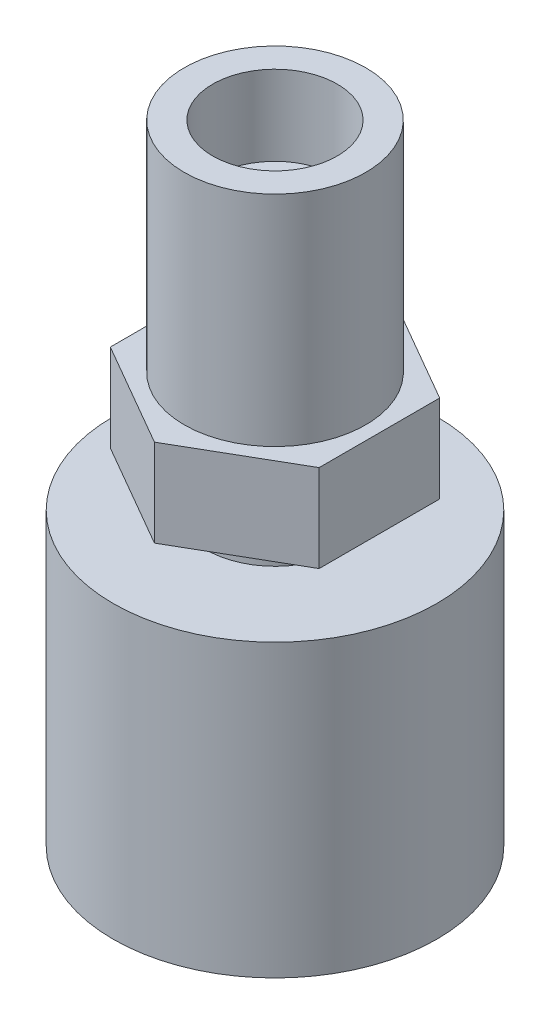
ISO-10303-21;
HEADER;
FILE_DESCRIPTION(('STEP AP214'),'2;1');
FILE_NAME('part.step','',(''),(''),'','','');
FILE_SCHEMA(('AUTOMOTIVE_DESIGN { 1 0 10303 214 1 1 1 1 }'));
ENDSEC;
DATA;
#1=APPLICATION_CONTEXT('core data for automotive mechanical design processes');
#2=APPLICATION_PROTOCOL_DEFINITION('international standard','automotive_design',2000,#1);
#3=PRODUCT_CONTEXT('',#1,'mechanical');
#4=PRODUCT('Part','Part','',(#3));
#5=PRODUCT_RELATED_PRODUCT_CATEGORY('part','',(#4));
#6=PRODUCT_DEFINITION_FORMATION('','',#4);
#7=PRODUCT_DEFINITION_CONTEXT('part definition',#1,'design');
#8=PRODUCT_DEFINITION('design','',#6,#7);
#9=PRODUCT_DEFINITION_SHAPE('','',#8);
#10=(LENGTH_UNIT() NAMED_UNIT(*) SI_UNIT(.MILLI.,.METRE.));
#11=(NAMED_UNIT(*) PLANE_ANGLE_UNIT() SI_UNIT($,.RADIAN.));
#12=(NAMED_UNIT(*) SI_UNIT($,.STERADIAN.) SOLID_ANGLE_UNIT());
#13=UNCERTAINTY_MEASURE_WITH_UNIT(LENGTH_MEASURE(1.E-05),#10,'distance_accuracy_value','');
#14=(GEOMETRIC_REPRESENTATION_CONTEXT(3) GLOBAL_UNCERTAINTY_ASSIGNED_CONTEXT((#13)) GLOBAL_UNIT_ASSIGNED_CONTEXT((#10,
#11,#12)) REPRESENTATION_CONTEXT('',''));
#15=CARTESIAN_POINT('',(0.,0.,0.));
#16=DIRECTION('',(0.,0.,1.));
#17=DIRECTION('',(1.,0.,0.));
#18=AXIS2_PLACEMENT_3D('',#15,#16,#17);
#19=CARTESIAN_POINT('',(0.,20.,0.));
#20=DIRECTION('',(0.,-1.,0.));
#21=DIRECTION('',(0.,0.,-1.));
#22=AXIS2_PLACEMENT_3D('',#19,#20,#21);
#23=CYLINDRICAL_SURFACE('',#22,8.3);
#24=CARTESIAN_POINT('',(0.,20.,0.));
#25=DIRECTION('',(0.,1.,0.));
#26=DIRECTION('',(0.,0.,1.));
#27=AXIS2_PLACEMENT_3D('',#24,#25,#26);
#28=CIRCLE('',#27,8.3);
#29=CARTESIAN_POINT('',(0.,20.,8.3));
#30=VERTEX_POINT('',#29);
#31=EDGE_CURVE('E152',#30,#30,#28,.T.);
#32=ORIENTED_EDGE('',*,*,#31,.F.);
#33=EDGE_LOOP('',(#32));
#34=FACE_BOUND('',#33,.T.);
#35=CARTESIAN_POINT('',(0.,0.,0.));
#36=DIRECTION('',(0.,1.,0.));
#37=DIRECTION('',(0.,0.,1.));
#38=AXIS2_PLACEMENT_3D('',#35,#36,#37);
#39=CIRCLE('',#38,8.3);
#40=CARTESIAN_POINT('',(0.,0.,8.3));
#41=VERTEX_POINT('',#40);
#42=EDGE_CURVE('E151',#41,#41,#39,.T.);
#43=ORIENTED_EDGE('',*,*,#42,.T.);
#44=EDGE_LOOP('',(#43));
#45=FACE_BOUND('',#44,.T.);
#46=ADVANCED_FACE('F35',(#34,#45),#23,.T.);
#47=CARTESIAN_POINT('',(0.,20.,0.));
#48=DIRECTION('',(0.,1.,0.));
#49=DIRECTION('',(0.,0.,1.));
#50=AXIS2_PLACEMENT_3D('',#47,#48,#49);
#51=PLANE('',#50);
#52=CARTESIAN_POINT('',(0.,20.,0.));
#53=DIRECTION('',(0.,1.,0.));
#54=DIRECTION('',(0.,0.,1.));
#55=AXIS2_PLACEMENT_3D('',#52,#53,#54);
#56=CIRCLE('',#55,5.7);
#57=CARTESIAN_POINT('',(0.,20.,5.7));
#58=VERTEX_POINT('',#57);
#59=EDGE_CURVE('E203',#58,#58,#56,.T.);
#60=ORIENTED_EDGE('',*,*,#59,.F.);
#61=EDGE_LOOP('',(#60));
#62=FACE_BOUND('',#61,.T.);
#63=ORIENTED_EDGE('',*,*,#31,.T.);
#64=EDGE_LOOP('',(#63));
#65=FACE_BOUND('',#64,.T.);
#66=ADVANCED_FACE('F224',(#62,#65),#51,.T.);
#67=CARTESIAN_POINT('',(9.55,-8.,5.51369507076093));
#68=DIRECTION('',(-0.5,0.,-0.866025403784439));
#69=DIRECTION('',(-0.866025403784439,0.,0.5));
#70=AXIS2_PLACEMENT_3D('',#67,#68,#69);
#71=PLANE('',#70);
#72=DIRECTION('',(-0.866025403784439,0.,0.5));
#73=VECTOR('',#72,1.);
#74=CARTESIAN_POINT('',(9.55,0.,5.51369507076093));
#75=LINE('',#74,#73);
#76=CARTESIAN_POINT('',(9.55,0.,5.51369507076093));
#77=VERTEX_POINT('',#76);
#78=CARTESIAN_POINT('',(0.,0.,11.0273901415219));
#79=VERTEX_POINT('',#78);
#80=EDGE_CURVE('E130',#77,#79,#75,.T.);
#81=ORIENTED_EDGE('',*,*,#80,.T.);
#82=DIRECTION('',(0.,1.,0.));
#83=VECTOR('',#82,1.);
#84=CARTESIAN_POINT('',(0.,-8.,11.0273901415219));
#85=LINE('',#84,#83);
#86=CARTESIAN_POINT('',(0.,-8.,11.0273901415219));
#87=VERTEX_POINT('',#86);
#88=EDGE_CURVE('E149',#87,#79,#85,.T.);
#89=ORIENTED_EDGE('',*,*,#88,.F.);
#90=DIRECTION('',(-0.866025403784439,0.,0.5));
#91=VECTOR('',#90,1.);
#92=CARTESIAN_POINT('',(9.55,-8.,5.51369507076093));
#93=LINE('',#92,#91);
#94=CARTESIAN_POINT('',(9.55,-8.,5.51369507076093));
#95=VERTEX_POINT('',#94);
#96=EDGE_CURVE('E142',#95,#87,#93,.T.);
#97=ORIENTED_EDGE('',*,*,#96,.F.);
#98=DIRECTION('',(0.,1.,0.));
#99=VECTOR('',#98,1.);
#100=CARTESIAN_POINT('',(9.55,-8.,5.51369507076093));
#101=LINE('',#100,#99);
#102=EDGE_CURVE('E126',#95,#77,#101,.T.);
#103=ORIENTED_EDGE('',*,*,#102,.T.);
#104=EDGE_LOOP('',(#81,#89,#97,#103));
#105=FACE_BOUND('',#104,.T.);
#106=ADVANCED_FACE('F222',(#105),#71,.F.);
#107=CARTESIAN_POINT('',(0.,-8.,11.0273901415219));
#108=DIRECTION('',(0.5,0.,-0.866025403784439));
#109=DIRECTION('',(-0.866025403784439,0.,-0.5));
#110=AXIS2_PLACEMENT_3D('',#107,#108,#109);
#111=PLANE('',#110);
#112=DIRECTION('',(-0.866025403784439,0.,-0.5));
#113=VECTOR('',#112,1.);
#114=CARTESIAN_POINT('',(0.,0.,11.0273901415219));
#115=LINE('',#114,#113);
#116=CARTESIAN_POINT('',(-9.55,0.,5.51369507076093));
#117=VERTEX_POINT('',#116);
#118=EDGE_CURVE('E133',#79,#117,#115,.T.);
#119=ORIENTED_EDGE('',*,*,#118,.T.);
#120=DIRECTION('',(0.,1.,0.));
#121=VECTOR('',#120,1.);
#122=CARTESIAN_POINT('',(-9.55,-8.,5.51369507076093));
#123=LINE('',#122,#121);
#124=CARTESIAN_POINT('',(-9.55,-8.,5.51369507076093));
#125=VERTEX_POINT('',#124);
#126=EDGE_CURVE('E146',#125,#117,#123,.T.);
#127=ORIENTED_EDGE('',*,*,#126,.F.);
#128=DIRECTION('',(-0.866025403784439,0.,-0.5));
#129=VECTOR('',#128,1.);
#130=CARTESIAN_POINT('',(0.,-8.,11.0273901415219));
#131=LINE('',#130,#129);
#132=EDGE_CURVE('E94',#87,#125,#131,.T.);
#133=ORIENTED_EDGE('',*,*,#132,.F.);
#134=ORIENTED_EDGE('',*,*,#88,.T.);
#135=EDGE_LOOP('',(#119,#127,#133,#134));
#136=FACE_BOUND('',#135,.T.);
#137=ADVANCED_FACE('F213',(#136),#111,.F.);
#138=CARTESIAN_POINT('',(-9.55,-8.,5.51369507076093));
#139=DIRECTION('',(1.,0.,0.));
#140=DIRECTION('',(0.,0.,-1.));
#141=AXIS2_PLACEMENT_3D('',#138,#139,#140);
#142=PLANE('',#141);
#143=DIRECTION('',(0.,0.,-1.));
#144=VECTOR('',#143,1.);
#145=CARTESIAN_POINT('',(-9.55,0.,5.51369507076093));
#146=LINE('',#145,#144);
#147=CARTESIAN_POINT('',(-9.55,0.,-5.51369507076093));
#148=VERTEX_POINT('',#147);
#149=EDGE_CURVE('E136',#117,#148,#146,.T.);
#150=ORIENTED_EDGE('',*,*,#149,.T.);
#151=DIRECTION('',(0.,1.,0.));
#152=VECTOR('',#151,1.);
#153=CARTESIAN_POINT('',(-9.55,-8.,-5.51369507076093));
#154=LINE('',#153,#152);
#155=CARTESIAN_POINT('',(-9.55,-8.,-5.51369507076093));
#156=VERTEX_POINT('',#155);
#157=EDGE_CURVE('E121',#156,#148,#154,.T.);
#158=ORIENTED_EDGE('',*,*,#157,.F.);
#159=DIRECTION('',(0.,0.,-1.));
#160=VECTOR('',#159,1.);
#161=CARTESIAN_POINT('',(-9.55,-8.,5.51369507076093));
#162=LINE('',#161,#160);
#163=EDGE_CURVE('E109',#125,#156,#162,.T.);
#164=ORIENTED_EDGE('',*,*,#163,.F.);
#165=ORIENTED_EDGE('',*,*,#126,.T.);
#166=EDGE_LOOP('',(#150,#158,#164,#165));
#167=FACE_BOUND('',#166,.T.);
#168=ADVANCED_FACE('F216',(#167),#142,.F.);
#169=CARTESIAN_POINT('',(-9.55,-8.,-5.51369507076093));
#170=DIRECTION('',(0.5,0.,0.866025403784439));
#171=DIRECTION('',(0.866025403784439,0.,-0.5));
#172=AXIS2_PLACEMENT_3D('',#169,#170,#171);
#173=PLANE('',#172);
#174=DIRECTION('',(0.866025403784439,0.,-0.5));
#175=VECTOR('',#174,1.);
#176=CARTESIAN_POINT('',(-9.55,0.,-5.51369507076093));
#177=LINE('',#176,#175);
#178=CARTESIAN_POINT('',(0.,0.,-11.0273901415219));
#179=VERTEX_POINT('',#178);
#180=EDGE_CURVE('E118',#148,#179,#177,.T.);
#181=ORIENTED_EDGE('',*,*,#180,.T.);
#182=DIRECTION('',(0.,1.,0.));
#183=VECTOR('',#182,1.);
#184=CARTESIAN_POINT('',(0.,-8.,-11.0273901415219));
#185=LINE('',#184,#183);
#186=CARTESIAN_POINT('',(0.,-8.,-11.0273901415219));
#187=VERTEX_POINT('',#186);
#188=EDGE_CURVE('E115',#187,#179,#185,.T.);
#189=ORIENTED_EDGE('',*,*,#188,.F.);
#190=DIRECTION('',(0.866025403784439,0.,-0.5));
#191=VECTOR('',#190,1.);
#192=CARTESIAN_POINT('',(-9.55,-8.,-5.51369507076093));
#193=LINE('',#192,#191);
#194=EDGE_CURVE('E102',#156,#187,#193,.T.);
#195=ORIENTED_EDGE('',*,*,#194,.F.);
#196=ORIENTED_EDGE('',*,*,#157,.T.);
#197=EDGE_LOOP('',(#181,#189,#195,#196));
#198=FACE_BOUND('',#197,.T.);
#199=ADVANCED_FACE('F116',(#198),#173,.F.);
#200=CARTESIAN_POINT('',(0.,-8.,-11.0273901415219));
#201=DIRECTION('',(-0.5,0.,0.866025403784439));
#202=DIRECTION('',(0.866025403784439,0.,0.5));
#203=AXIS2_PLACEMENT_3D('',#200,#201,#202);
#204=PLANE('',#203);
#205=DIRECTION('',(0.866025403784439,0.,0.5));
#206=VECTOR('',#205,1.);
#207=CARTESIAN_POINT('',(0.,0.,-11.0273901415219));
#208=LINE('',#207,#206);
#209=CARTESIAN_POINT('',(9.55,0.,-5.51369507076093));
#210=VERTEX_POINT('',#209);
#211=EDGE_CURVE('E139',#179,#210,#208,.T.);
#212=ORIENTED_EDGE('',*,*,#211,.T.);
#213=DIRECTION('',(0.,1.,0.));
#214=VECTOR('',#213,1.);
#215=CARTESIAN_POINT('',(9.55,-8.,-5.51369507076093));
#216=LINE('',#215,#214);
#217=CARTESIAN_POINT('',(9.55,-8.,-5.51369507076093));
#218=VERTEX_POINT('',#217);
#219=EDGE_CURVE('E122',#218,#210,#216,.T.);
#220=ORIENTED_EDGE('',*,*,#219,.F.);
#221=DIRECTION('',(0.866025403784439,0.,0.5));
#222=VECTOR('',#221,1.);
#223=CARTESIAN_POINT('',(0.,-8.,-11.0273901415219));
#224=LINE('',#223,#222);
#225=EDGE_CURVE('E106',#187,#218,#224,.T.);
#226=ORIENTED_EDGE('',*,*,#225,.F.);
#227=ORIENTED_EDGE('',*,*,#188,.T.);
#228=EDGE_LOOP('',(#212,#220,#226,#227));
#229=FACE_BOUND('',#228,.T.);
#230=ADVANCED_FACE('F124',(#229),#204,.F.);
#231=CARTESIAN_POINT('',(9.55,-8.,-5.51369507076093));
#232=DIRECTION('',(-1.,0.,0.));
#233=DIRECTION('',(0.,0.,1.));
#234=AXIS2_PLACEMENT_3D('',#231,#232,#233);
#235=PLANE('',#234);
#236=DIRECTION('',(0.,0.,1.));
#237=VECTOR('',#236,1.);
#238=CARTESIAN_POINT('',(9.55,0.,-5.51369507076093));
#239=LINE('',#238,#237);
#240=EDGE_CURVE('E85',#210,#77,#239,.T.);
#241=ORIENTED_EDGE('',*,*,#240,.T.);
#242=ORIENTED_EDGE('',*,*,#102,.F.);
#243=DIRECTION('',(0.,0.,1.));
#244=VECTOR('',#243,1.);
#245=CARTESIAN_POINT('',(9.55,-8.,-5.51369507076093));
#246=LINE('',#245,#244);
#247=EDGE_CURVE('E58',#218,#95,#246,.T.);
#248=ORIENTED_EDGE('',*,*,#247,.F.);
#249=ORIENTED_EDGE('',*,*,#219,.T.);
#250=EDGE_LOOP('',(#241,#242,#248,#249));
#251=FACE_BOUND('',#250,.T.);
#252=ADVANCED_FACE('F220',(#251),#235,.F.);
#253=CARTESIAN_POINT('',(0.,-8.,0.));
#254=DIRECTION('',(0.,-1.,0.));
#255=DIRECTION('',(0.,0.,-1.));
#256=AXIS2_PLACEMENT_3D('',#253,#254,#255);
#257=PLANE('',#256);
#258=CARTESIAN_POINT('',(0.,-8.,0.));
#259=DIRECTION('',(0.,-1.,0.));
#260=DIRECTION('',(0.,0.,-1.));
#261=AXIS2_PLACEMENT_3D('',#258,#259,#260);
#262=CIRCLE('',#261,6.3);
#263=CARTESIAN_POINT('',(0.,-8.,-6.3));
#264=VERTEX_POINT('',#263);
#265=EDGE_CURVE('E155',#264,#264,#262,.T.);
#266=ORIENTED_EDGE('',*,*,#265,.F.);
#267=EDGE_LOOP('',(#266));
#268=FACE_BOUND('',#267,.T.);
#269=ORIENTED_EDGE('',*,*,#96,.T.);
#270=ORIENTED_EDGE('',*,*,#132,.T.);
#271=ORIENTED_EDGE('',*,*,#163,.T.);
#272=ORIENTED_EDGE('',*,*,#194,.T.);
#273=ORIENTED_EDGE('',*,*,#225,.T.);
#274=ORIENTED_EDGE('',*,*,#247,.T.);
#275=EDGE_LOOP('',(#269,#270,#271,#272,#273,#274));
#276=FACE_BOUND('',#275,.T.);
#277=ADVANCED_FACE('F104',(#268,#276),#257,.T.);
#278=CARTESIAN_POINT('',(0.,0.,0.));
#279=DIRECTION('',(0.,-1.,0.));
#280=DIRECTION('',(0.,0.,-1.));
#281=AXIS2_PLACEMENT_3D('',#278,#279,#280);
#282=PLANE('',#281);
#283=ORIENTED_EDGE('',*,*,#42,.F.);
#284=EDGE_LOOP('',(#283));
#285=FACE_BOUND('',#284,.T.);
#286=ORIENTED_EDGE('',*,*,#80,.F.);
#287=ORIENTED_EDGE('',*,*,#240,.F.);
#288=ORIENTED_EDGE('',*,*,#211,.F.);
#289=ORIENTED_EDGE('',*,*,#180,.F.);
#290=ORIENTED_EDGE('',*,*,#149,.F.);
#291=ORIENTED_EDGE('',*,*,#118,.F.);
#292=EDGE_LOOP('',(#286,#287,#288,#289,#290,#291));
#293=FACE_BOUND('',#292,.T.);
#294=ADVANCED_FACE('F219',(#285,#293),#282,.F.);
#295=CARTESIAN_POINT('',(0.,12.7,0.));
#296=DIRECTION('',(0.,1.,0.));
#297=DIRECTION('',(0.,0.,1.));
#298=AXIS2_PLACEMENT_3D('',#295,#296,#297);
#299=PLANE('',#298);
#300=CARTESIAN_POINT('',(0.,12.7,0.));
#301=DIRECTION('',(0.,1.,0.));
#302=DIRECTION('',(0.,0.,1.));
#303=AXIS2_PLACEMENT_3D('',#300,#301,#302);
#304=CIRCLE('',#303,5.7);
#305=CARTESIAN_POINT('',(0.,12.7,5.7));
#306=VERTEX_POINT('',#305);
#307=EDGE_CURVE('E161',#306,#306,#304,.T.);
#308=ORIENTED_EDGE('',*,*,#307,.T.);
#309=EDGE_LOOP('',(#308));
#310=FACE_BOUND('',#309,.T.);
#311=CARTESIAN_POINT('',(0.,12.7,0.));
#312=DIRECTION('',(0.,1.,0.));
#313=DIRECTION('',(0.,0.,1.));
#314=AXIS2_PLACEMENT_3D('',#311,#312,#313);
#315=CIRCLE('',#314,4.6);
#316=CARTESIAN_POINT('',(0.,12.7,4.6));
#317=VERTEX_POINT('',#316);
#318=EDGE_CURVE('E158',#317,#317,#315,.F.);
#319=ORIENTED_EDGE('',*,*,#318,.T.);
#320=EDGE_LOOP('',(#319));
#321=FACE_BOUND('',#320,.T.);
#322=ADVANCED_FACE('F243',(#310,#321),#299,.T.);
#323=CARTESIAN_POINT('',(0.,12.7,0.));
#324=DIRECTION('',(0.,1.,0.));
#325=DIRECTION('',(0.,0.,1.));
#326=AXIS2_PLACEMENT_3D('',#323,#324,#325);
#327=CYLINDRICAL_SURFACE('',#326,5.7);
#328=ORIENTED_EDGE('',*,*,#307,.F.);
#329=EDGE_LOOP('',(#328));
#330=FACE_BOUND('',#329,.T.);
#331=ORIENTED_EDGE('',*,*,#59,.T.);
#332=EDGE_LOOP('',(#331));
#333=FACE_BOUND('',#332,.T.);
#334=ADVANCED_FACE('F249',(#330,#333),#327,.F.);
#335=CARTESIAN_POINT('',(0.,4.,0.));
#336=DIRECTION('',(0.,1.,0.));
#337=DIRECTION('',(0.,0.,1.));
#338=AXIS2_PLACEMENT_3D('',#335,#336,#337);
#339=PLANE('',#338);
#340=CARTESIAN_POINT('',(0.,4.,0.));
#341=DIRECTION('',(0.,1.,0.));
#342=DIRECTION('',(0.,0.,1.));
#343=AXIS2_PLACEMENT_3D('',#340,#341,#342);
#344=CIRCLE('',#343,3.1);
#345=CARTESIAN_POINT('',(0.,4.,3.1));
#346=VERTEX_POINT('',#345);
#347=EDGE_CURVE('E198',#346,#346,#344,.T.);
#348=ORIENTED_EDGE('',*,*,#347,.F.);
#349=EDGE_LOOP('',(#348));
#350=FACE_BOUND('',#349,.T.);
#351=CARTESIAN_POINT('',(0.,4.,0.));
#352=DIRECTION('',(0.,1.,0.));
#353=DIRECTION('',(0.,0.,1.));
#354=AXIS2_PLACEMENT_3D('',#351,#352,#353);
#355=CIRCLE('',#354,4.6);
#356=CARTESIAN_POINT('',(0.,4.,4.6));
#357=VERTEX_POINT('',#356);
#358=EDGE_CURVE('E134',#357,#357,#355,.T.);
#359=ORIENTED_EDGE('',*,*,#358,.T.);
#360=EDGE_LOOP('',(#359));
#361=FACE_BOUND('',#360,.T.);
#362=ADVANCED_FACE('F290',(#350,#361),#339,.T.);
#363=CARTESIAN_POINT('',(0.,4.,0.));
#364=DIRECTION('',(0.,1.,0.));
#365=DIRECTION('',(0.,0.,1.));
#366=AXIS2_PLACEMENT_3D('',#363,#364,#365);
#367=CYLINDRICAL_SURFACE('',#366,4.6);
#368=ORIENTED_EDGE('',*,*,#358,.F.);
#369=EDGE_LOOP('',(#368));
#370=FACE_BOUND('',#369,.T.);
#371=ORIENTED_EDGE('',*,*,#318,.F.);
#372=EDGE_LOOP('',(#371));
#373=FACE_BOUND('',#372,.T.);
#374=ADVANCED_FACE('F313',(#370,#373),#367,.F.);
#375=CARTESIAN_POINT('',(0.,2.,0.));
#376=DIRECTION('',(0.,1.,0.));
#377=DIRECTION('',(0.,0.,1.));
#378=AXIS2_PLACEMENT_3D('',#375,#376,#377);
#379=CYLINDRICAL_SURFACE('',#378,3.1);
#380=CARTESIAN_POINT('',(0.,3.99989999749987,0.));
#381=DIRECTION('',(0.,-1.,0.));
#382=DIRECTION('',(0.,0.,-1.));
#383=AXIS2_PLACEMENT_3D('',#380,#381,#382);
#384=CIRCLE('',#383,3.1);
#385=CARTESIAN_POINT('',(0.,3.99989999749987,-3.1));
#386=VERTEX_POINT('',#385);
#387=EDGE_CURVE('E43',#386,#386,#384,.T.);
#388=ORIENTED_EDGE('',*,*,#387,.T.);
#389=EDGE_LOOP('',(#388));
#390=FACE_BOUND('',#389,.T.);
#391=ORIENTED_EDGE('',*,*,#347,.T.);
#392=EDGE_LOOP('',(#391));
#393=FACE_BOUND('',#392,.T.);
#394=ADVANCED_FACE('F301',(#390,#393),#379,.F.);
#395=CARTESIAN_POINT('',(0.,-10.9,0.));
#396=DIRECTION('',(0.,1.,0.));
#397=DIRECTION('',(0.,0.,1.));
#398=AXIS2_PLACEMENT_3D('',#395,#396,#397);
#399=CYLINDRICAL_SURFACE('',#398,6.3);
#400=CARTESIAN_POINT('',(0.,-10.9,0.));
#401=DIRECTION('',(0.,-1.,0.));
#402=DIRECTION('',(0.,0.,-1.));
#403=AXIS2_PLACEMENT_3D('',#400,#401,#402);
#404=CIRCLE('',#403,6.3);
#405=CARTESIAN_POINT('',(0.,-10.9,-6.3));
#406=VERTEX_POINT('',#405);
#407=EDGE_CURVE('E193',#406,#406,#404,.T.);
#408=ORIENTED_EDGE('',*,*,#407,.F.);
#409=EDGE_LOOP('',(#408));
#410=FACE_BOUND('',#409,.T.);
#411=ORIENTED_EDGE('',*,*,#265,.T.);
#412=EDGE_LOOP('',(#411));
#413=FACE_BOUND('',#412,.T.);
#414=ADVANCED_FACE('F295',(#410,#413),#399,.T.);
#415=CARTESIAN_POINT('',(0.,-8.5,0.));
#416=DIRECTION('',(0.,1.,0.));
#417=DIRECTION('',(0.,0.,1.));
#418=AXIS2_PLACEMENT_3D('',#415,#416,#417);
#419=CYLINDRICAL_SURFACE('',#418,2.);
#420=CARTESIAN_POINT('',(0.,-8.5,0.));
#421=DIRECTION('',(0.,1.,0.));
#422=DIRECTION('',(0.,0.,1.));
#423=AXIS2_PLACEMENT_3D('',#420,#421,#422);
#424=CIRCLE('',#423,2.);
#425=CARTESIAN_POINT('',(0.904944189161049,-8.5,1.78355712398108));
#426=VERTEX_POINT('',#425);
#427=CARTESIAN_POINT('',(-0.904944189161049,-8.5,1.78355712398108));
#428=VERTEX_POINT('',#427);
#429=EDGE_CURVE('E190',#426,#428,#424,.T.);
#430=ORIENTED_EDGE('',*,*,#429,.F.);
#431=CARTESIAN_POINT('',(0.90494418916105,-8.5,1.78355712398108));
#432=CARTESIAN_POINT('',(0.892989769446277,-8.44807403524213,1.78959804632058));
#433=CARTESIAN_POINT('',(0.87958075785023,-8.39649634717968,1.7962731771308));
#434=CARTESIAN_POINT('',(0.849096545553649,-8.29427415792694,1.81089677939172));
#435=CARTESIAN_POINT('',(0.831999039382565,-8.24363746586613,1.81885291976016));
#436=CARTESIAN_POINT('',(0.793168300773759,-8.14330378477822,1.83612055290898));
#437=CARTESIAN_POINT('',(0.771357520400834,-8.09363987285667,1.84545376968097));
#438=CARTESIAN_POINT('',(0.72251423038465,-7.9972844453323,1.86511858340736));
#439=CARTESIAN_POINT('',(0.695496555742713,-7.95058497462693,1.87544730323835));
#440=CARTESIAN_POINT('',(0.638342271685261,-7.86572978934757,1.89561146846144));
#441=CARTESIAN_POINT('',(0.608772361279299,-7.82718540331558,1.90539577263651));
#442=CARTESIAN_POINT('',(0.544378637901212,-7.75492936996016,1.92477952433773));
#443=CARTESIAN_POINT('',(0.50957705229399,-7.72119840086021,1.934379568893));
#444=CARTESIAN_POINT('',(0.43410541630842,-7.65956909801613,1.9527097711424));
#445=CARTESIAN_POINT('',(0.393367830019499,-7.63174843274394,1.96142763999838));
#446=CARTESIAN_POINT('',(0.306974267714043,-7.58423826393427,1.97678527374472));
#447=CARTESIAN_POINT('',(0.261319988831246,-7.56454596593475,1.98342575263329));
#448=CARTESIAN_POINT('',(0.172235930801788,-7.53656608237283,1.99301243544466));
#449=CARTESIAN_POINT('',(0.129181461914784,-7.52720527124619,1.99630262589645));
#450=CARTESIAN_POINT('',(0.0419699618530467,-7.51660816002673,2.00003409672047));
#451=CARTESIAN_POINT('',(-0.00218617393988612,-7.51536546482144,2.00047761957366));
#452=CARTESIAN_POINT('',(-0.0840293069922646,-7.52068890621359,1.99859714714262));
#453=CARTESIAN_POINT('',(-0.121795690169235,-7.52623854714103,1.99663335195481));
#454=CARTESIAN_POINT('',(-0.19581561174001,-7.54319281082264,1.99073709249517));
#455=CARTESIAN_POINT('',(-0.232069364078497,-7.55459660251661,1.98680490765958));
#456=CARTESIAN_POINT('',(-0.302725904024786,-7.58291605915554,1.97728317918161));
#457=CARTESIAN_POINT('',(-0.337093974649205,-7.59990970439496,1.9716702948184));
#458=CARTESIAN_POINT('',(-0.402819052487824,-7.63860527576489,1.95930015965971));
#459=CARTESIAN_POINT('',(-0.434174979920091,-7.66030888128528,1.95254250087093));
#460=CARTESIAN_POINT('',(-0.506978960036429,-7.71828988022274,1.93518447392238));
#461=CARTESIAN_POINT('',(-0.546620120911597,-7.75673083373031,1.92422316088905));
#462=CARTESIAN_POINT('',(-0.619054513067053,-7.83957599759773,1.90215929047299));
#463=CARTESIAN_POINT('',(-0.651830273607425,-7.88399496031942,1.89105644722457));
#464=CARTESIAN_POINT('',(-0.727306670168203,-8.00216813367106,1.86371333528101));
#465=CARTESIAN_POINT('',(-0.765719884164872,-8.07874511809594,1.84796053901364));
#466=CARTESIAN_POINT('',(-0.831016400386962,-8.23705590214544,1.81952268390857));
#467=CARTESIAN_POINT('',(-0.857884394328436,-8.31879638465382,1.80684170777812));
#468=CARTESIAN_POINT('',(-0.884825447252803,-8.41812283166706,1.79362915186226));
#469=CARTESIAN_POINT('',(-0.889075626645068,-8.4344584391043,1.79152569203863));
#470=CARTESIAN_POINT('',(-0.89724788649239,-8.46718138037966,1.78744738717085));
#471=CARTESIAN_POINT('',(-0.901170798122223,-8.48356846623236,1.78547221931409));
#472=CARTESIAN_POINT('',(-0.904944189161316,-8.49999999999991,1.78355712398094));
#473=B_SPLINE_CURVE_WITH_KNOTS('',3,(#431,#432,#433,#434,#435,#436,#437,#438,#439,#440,#441,
#442,#443,#444,#445,#446,#447,#448,#449,#450,#451,#452,#453,#454,#455,#456,#457,#458,#459,#460,
#461,#462,#463,#464,#465,#466,#467,#468,#469,#470,#471,#472),.UNSPECIFIED.,.F.,.F.,(4,2,2,2,2,2,
2,2,2,2,2,2,2,2,2,2,2,2,2,2,4),(0.,0.160940594628639,0.32288318478162,0.487726424830601,
0.652106772399809,0.800347278156513,0.947974893409025,1.09743657308143,1.24684682624397,
1.37858982731396,1.51022903422553,1.624361932761,1.73847863337207,1.85426006676933,
1.97008285138264,2.13801804789016,2.30637554083523,2.56623458574258,2.82643713317342,
2.87746687026157,2.92836278754606),.UNSPECIFIED.);
#474=EDGE_CURVE('E49',#426,#428,#473,.T.);
#475=ORIENTED_EDGE('',*,*,#474,.T.);
#476=EDGE_LOOP('',(#430,#475));
#477=FACE_BOUND('',#476,.T.);
#478=CARTESIAN_POINT('',(0.,2.,0.));
#479=DIRECTION('',(0.,1.,0.));
#480=DIRECTION('',(0.,0.,1.));
#481=AXIS2_PLACEMENT_3D('',#478,#479,#480);
#482=CIRCLE('',#481,2.);
#483=CARTESIAN_POINT('',(0.,2.,2.));
#484=VERTEX_POINT('',#483);
#485=EDGE_CURVE('E187',#484,#484,#482,.T.);
#486=ORIENTED_EDGE('',*,*,#485,.T.);
#487=EDGE_LOOP('',(#486));
#488=FACE_BOUND('',#487,.T.);
#489=ADVANCED_FACE('F300',(#477,#488),#419,.F.);
#490=CARTESIAN_POINT('',(0.,-8.5,0.));
#491=DIRECTION('',(0.,1.,0.));
#492=DIRECTION('',(0.,0.,1.));
#493=AXIS2_PLACEMENT_3D('',#490,#491,#492);
#494=PLANE('',#493);
#495=CARTESIAN_POINT('',(0.,-8.5,1.32337662337662));
#496=DIRECTION('',(0.,1.,0.));
#497=DIRECTION('',(0.,0.,1.));
#498=AXIS2_PLACEMENT_3D('',#495,#496,#497);
#499=ELLIPSE('',#498,1.08142834528265,1.);
#500=EDGE_CURVE('E473',#426,#428,#499,.T.);
#501=ORIENTED_EDGE('',*,*,#500,.F.);
#502=ORIENTED_EDGE('',*,*,#429,.T.);
#503=EDGE_LOOP('',(#501,#502));
#504=FACE_BOUND('',#503,.T.);
#505=ADVANCED_FACE('F326',(#504),#494,.T.);
#506=CARTESIAN_POINT('',(0.,3.99989999749987,0.));
#507=DIRECTION('',(0.,-1.,0.));
#508=DIRECTION('',(0.,0.,-1.));
#509=AXIS2_PLACEMENT_3D('',#506,#507,#508);
#510=DEGENERATE_TOROIDAL_SURFACE('',#509,0.731999999999998,2.368,.T.);
#511=ORIENTED_EDGE('',*,*,#387,.F.);
#512=EDGE_LOOP('',(#511));
#513=FACE_BOUND('',#512,.T.);
#514=ORIENTED_EDGE('',*,*,#485,.F.);
#515=EDGE_LOOP('',(#514));
#516=FACE_BOUND('',#515,.T.);
#517=ADVANCED_FACE('F37',(#513,#516),#510,.F.);
#518=CARTESIAN_POINT('',(0.,-37.5,0.));
#519=DIRECTION('',(0.,1.,0.));
#520=DIRECTION('',(0.,0.,1.));
#521=AXIS2_PLACEMENT_3D('',#518,#519,#520);
#522=CYLINDRICAL_SURFACE('',#521,14.8);
#523=CARTESIAN_POINT('',(0.,-37.5,0.));
#524=DIRECTION('',(0.,-1.,0.));
#525=DIRECTION('',(0.,0.,-1.));
#526=AXIS2_PLACEMENT_3D('',#523,#524,#525);
#527=CIRCLE('',#526,14.8);
#528=CARTESIAN_POINT('',(0.,-37.5,-14.8));
#529=VERTEX_POINT('',#528);
#530=EDGE_CURVE('E184',#529,#529,#527,.T.);
#531=ORIENTED_EDGE('',*,*,#530,.F.);
#532=EDGE_LOOP('',(#531));
#533=FACE_BOUND('',#532,.T.);
#534=CARTESIAN_POINT('',(0.,-10.9,0.));
#535=DIRECTION('',(0.,-1.,0.));
#536=DIRECTION('',(0.,0.,-1.));
#537=AXIS2_PLACEMENT_3D('',#534,#535,#536);
#538=CIRCLE('',#537,14.8);
#539=CARTESIAN_POINT('',(0.,-10.9,-14.8));
#540=VERTEX_POINT('',#539);
#541=EDGE_CURVE('E170',#540,#540,#538,.T.);
#542=ORIENTED_EDGE('',*,*,#541,.T.);
#543=EDGE_LOOP('',(#542));
#544=FACE_BOUND('',#543,.T.);
#545=ADVANCED_FACE('F325',(#533,#544),#522,.T.);
#546=CARTESIAN_POINT('',(0.,-37.5,0.));
#547=DIRECTION('',(0.,-1.,0.));
#548=DIRECTION('',(0.,0.,-1.));
#549=AXIS2_PLACEMENT_3D('',#546,#547,#548);
#550=PLANE('',#549);
#551=CARTESIAN_POINT('',(0.,-37.5,0.));
#552=DIRECTION('',(0.,-1.,0.));
#553=DIRECTION('',(0.,0.,-1.));
#554=AXIS2_PLACEMENT_3D('',#551,#552,#553);
#555=CIRCLE('',#554,13.6);
#556=CARTESIAN_POINT('',(0.,-37.5,-13.6));
#557=VERTEX_POINT('',#556);
#558=EDGE_CURVE('E173',#557,#557,#555,.T.);
#559=ORIENTED_EDGE('',*,*,#558,.F.);
#560=EDGE_LOOP('',(#559));
#561=FACE_BOUND('',#560,.T.);
#562=ORIENTED_EDGE('',*,*,#530,.T.);
#563=EDGE_LOOP('',(#562));
#564=FACE_BOUND('',#563,.T.);
#565=ADVANCED_FACE('F337',(#561,#564),#550,.T.);
#566=CARTESIAN_POINT('',(0.,-10.9,0.));
#567=DIRECTION('',(0.,-1.,0.));
#568=DIRECTION('',(0.,0.,-1.));
#569=AXIS2_PLACEMENT_3D('',#566,#567,#568);
#570=PLANE('',#569);
#571=ORIENTED_EDGE('',*,*,#407,.T.);
#572=EDGE_LOOP('',(#571));
#573=FACE_BOUND('',#572,.T.);
#574=ORIENTED_EDGE('',*,*,#541,.F.);
#575=EDGE_LOOP('',(#574));
#576=FACE_BOUND('',#575,.T.);
#577=ADVANCED_FACE('F345',(#573,#576),#570,.F.);
#578=CARTESIAN_POINT('',(0.,-36.3,0.));
#579=DIRECTION('',(0.,-1.,0.));
#580=DIRECTION('',(0.,0.,-1.));
#581=AXIS2_PLACEMENT_3D('',#578,#579,#580);
#582=PLANE('',#581);
#583=CARTESIAN_POINT('',(0.,-36.3,0.));
#584=DIRECTION('',(0.,-1.,0.));
#585=DIRECTION('',(0.,0.,-1.));
#586=AXIS2_PLACEMENT_3D('',#583,#584,#585);
#587=CIRCLE('',#586,13.6);
#588=CARTESIAN_POINT('',(0.,-36.3,-13.6));
#589=VERTEX_POINT('',#588);
#590=EDGE_CURVE('E166',#589,#589,#587,.T.);
#591=ORIENTED_EDGE('',*,*,#590,.T.);
#592=EDGE_LOOP('',(#591));
#593=FACE_BOUND('',#592,.T.);
#594=CARTESIAN_POINT('',(0.,-36.3,0.));
#595=DIRECTION('',(0.,-1.,0.));
#596=DIRECTION('',(0.,0.,-1.));
#597=AXIS2_PLACEMENT_3D('',#594,#595,#596);
#598=CIRCLE('',#597,11.1);
#599=CARTESIAN_POINT('',(0.,-36.3,-11.1));
#600=VERTEX_POINT('',#599);
#601=EDGE_CURVE('E163',#600,#600,#598,.F.);
#602=ORIENTED_EDGE('',*,*,#601,.T.);
#603=EDGE_LOOP('',(#602));
#604=FACE_BOUND('',#603,.T.);
#605=ADVANCED_FACE('F350',(#593,#604),#582,.T.);
#606=CARTESIAN_POINT('',(0.,-36.3,0.));
#607=DIRECTION('',(0.,-1.,0.));
#608=DIRECTION('',(0.,0.,-1.));
#609=AXIS2_PLACEMENT_3D('',#606,#607,#608);
#610=CYLINDRICAL_SURFACE('',#609,13.6);
#611=ORIENTED_EDGE('',*,*,#590,.F.);
#612=EDGE_LOOP('',(#611));
#613=FACE_BOUND('',#612,.T.);
#614=ORIENTED_EDGE('',*,*,#558,.T.);
#615=EDGE_LOOP('',(#614));
#616=FACE_BOUND('',#615,.T.);
#617=ADVANCED_FACE('F368',(#613,#616),#610,.F.);
#618=CARTESIAN_POINT('',(0.,-29.6,0.));
#619=DIRECTION('',(0.,-1.,0.));
#620=DIRECTION('',(0.,0.,-1.));
#621=AXIS2_PLACEMENT_3D('',#618,#619,#620);
#622=PLANE('',#621);
#623=CARTESIAN_POINT('',(0.,-29.6,10.01));
#624=DIRECTION('',(0.,-1.,0.));
#625=DIRECTION('',(0.,0.,1.));
#626=AXIS2_PLACEMENT_3D('',#623,#624,#625);
#627=ELLIPSE('',#626,1.08142834528265,1.);
#628=CARTESIAN_POINT('',(0.,-29.6,11.0914283452826));
#629=VERTEX_POINT('',#628);
#630=EDGE_CURVE('E554',#629,#629,#627,.F.);
#631=ORIENTED_EDGE('',*,*,#630,.T.);
#632=EDGE_LOOP('',(#631));
#633=FACE_BOUND('',#632,.T.);
#634=CARTESIAN_POINT('',(0.,-29.6,0.));
#635=DIRECTION('',(0.,-1.,0.));
#636=DIRECTION('',(0.,0.,-1.));
#637=AXIS2_PLACEMENT_3D('',#634,#635,#636);
#638=CIRCLE('',#637,8.4);
#639=CARTESIAN_POINT('',(0.,-29.6,-8.4));
#640=VERTEX_POINT('',#639);
#641=EDGE_CURVE('E181',#640,#640,#638,.T.);
#642=ORIENTED_EDGE('',*,*,#641,.F.);
#643=EDGE_LOOP('',(#642));
#644=FACE_BOUND('',#643,.T.);
#645=CARTESIAN_POINT('',(0.,-29.6,0.));
#646=DIRECTION('',(0.,-1.,0.));
#647=DIRECTION('',(0.,0.,-1.));
#648=AXIS2_PLACEMENT_3D('',#645,#646,#647);
#649=CIRCLE('',#648,11.1);
#650=CARTESIAN_POINT('',(0.,-29.6,-11.1));
#651=VERTEX_POINT('',#650);
#652=EDGE_CURVE('E165',#651,#651,#649,.T.);
#653=ORIENTED_EDGE('',*,*,#652,.T.);
#654=EDGE_LOOP('',(#653));
#655=FACE_BOUND('',#654,.T.);
#656=ADVANCED_FACE('F378',(#633,#644,#655),#622,.T.);
#657=CARTESIAN_POINT('',(0.,-29.6,0.));
#658=DIRECTION('',(0.,-1.,0.));
#659=DIRECTION('',(0.,0.,-1.));
#660=AXIS2_PLACEMENT_3D('',#657,#658,#659);
#661=CYLINDRICAL_SURFACE('',#660,11.1);
#662=ORIENTED_EDGE('',*,*,#652,.F.);
#663=EDGE_LOOP('',(#662));
#664=FACE_BOUND('',#663,.T.);
#665=ORIENTED_EDGE('',*,*,#601,.F.);
#666=EDGE_LOOP('',(#665));
#667=FACE_BOUND('',#666,.T.);
#668=ADVANCED_FACE('F386',(#664,#667),#661,.F.);
#669=CARTESIAN_POINT('',(0.,-32.,0.));
#670=DIRECTION('',(0.,-1.,0.));
#671=DIRECTION('',(0.,0.,-1.));
#672=AXIS2_PLACEMENT_3D('',#669,#670,#671);
#673=PLANE('',#672);
#674=CARTESIAN_POINT('',(0.,-32.,0.));
#675=DIRECTION('',(0.,-1.,0.));
#676=DIRECTION('',(0.,0.,-1.));
#677=AXIS2_PLACEMENT_3D('',#674,#675,#676);
#678=CIRCLE('',#677,8.4);
#679=CARTESIAN_POINT('',(0.,-32.,-8.4));
#680=VERTEX_POINT('',#679);
#681=EDGE_CURVE('E178',#680,#680,#678,.T.);
#682=ORIENTED_EDGE('',*,*,#681,.T.);
#683=EDGE_LOOP('',(#682));
#684=FACE_BOUND('',#683,.T.);
#685=CARTESIAN_POINT('',(0.,-32.,0.));
#686=DIRECTION('',(0.,-1.,0.));
#687=DIRECTION('',(0.,0.,-1.));
#688=AXIS2_PLACEMENT_3D('',#685,#686,#687);
#689=CIRCLE('',#688,6.3);
#690=CARTESIAN_POINT('',(0.,-32.,-6.3));
#691=VERTEX_POINT('',#690);
#692=EDGE_CURVE('E472',#691,#691,#689,.T.);
#693=ORIENTED_EDGE('',*,*,#692,.F.);
#694=EDGE_LOOP('',(#693));
#695=FACE_BOUND('',#694,.T.);
#696=ADVANCED_FACE('F390',(#684,#695),#673,.T.);
#697=CARTESIAN_POINT('',(0.,-32.,0.));
#698=DIRECTION('',(0.,1.,0.));
#699=DIRECTION('',(0.,0.,1.));
#700=AXIS2_PLACEMENT_3D('',#697,#698,#699);
#701=CYLINDRICAL_SURFACE('',#700,8.4);
#702=ORIENTED_EDGE('',*,*,#681,.F.);
#703=EDGE_LOOP('',(#702));
#704=FACE_BOUND('',#703,.T.);
#705=ORIENTED_EDGE('',*,*,#641,.T.);
#706=EDGE_LOOP('',(#705));
#707=FACE_BOUND('',#706,.T.);
#708=ADVANCED_FACE('F400',(#704,#707),#701,.T.);
#709=CARTESIAN_POINT('',(0.,-32.,0.));
#710=DIRECTION('',(0.,1.,0.));
#711=DIRECTION('',(0.,0.,1.));
#712=AXIS2_PLACEMENT_3D('',#709,#710,#711);
#713=CYLINDRICAL_SURFACE('',#712,6.3);
#714=ORIENTED_EDGE('',*,*,#692,.T.);
#715=EDGE_LOOP('',(#714));
#716=FACE_BOUND('',#715,.T.);
#717=CARTESIAN_POINT('',(0.,-29.6,0.));
#718=DIRECTION('',(0.,-1.,0.));
#719=DIRECTION('',(0.,0.,-1.));
#720=AXIS2_PLACEMENT_3D('',#717,#718,#719);
#721=CIRCLE('',#720,6.3);
#722=CARTESIAN_POINT('',(0.,-29.6,-6.3));
#723=VERTEX_POINT('',#722);
#724=EDGE_CURVE('E11',#723,#723,#721,.F.);
#725=ORIENTED_EDGE('',*,*,#724,.T.);
#726=EDGE_LOOP('',(#725));
#727=FACE_BOUND('',#726,.T.);
#728=ADVANCED_FACE('F410',(#716,#727),#713,.F.);
#729=ORIENTED_EDGE('',*,*,#724,.F.);
#730=EDGE_LOOP('',(#729));
#731=FACE_BOUND('',#730,.T.);
#732=ADVANCED_FACE('F420',(#731),#622,.T.);
#733=CARTESIAN_POINT('',(0.,-6.5,0.499999999999997));
#734=DIRECTION('',(0.,-0.924702967480136,0.380689403495069));
#735=DIRECTION('',(0.,-0.380689403495069,-0.924702967480136));
#736=AXIS2_PLACEMENT_3D('',#733,#734,#735);
#737=CYLINDRICAL_SURFACE('',#736,1.);
#738=ORIENTED_EDGE('',*,*,#630,.F.);
#739=EDGE_LOOP('',(#738));
#740=FACE_BOUND('',#739,.T.);
#741=ORIENTED_EDGE('',*,*,#500,.T.);
#742=ORIENTED_EDGE('',*,*,#474,.F.);
#743=EDGE_LOOP('',(#741,#742));
#744=FACE_BOUND('',#743,.T.);
#745=ADVANCED_FACE('F430',(#740,#744),#737,.F.);
#746=CLOSED_SHELL('',(#46,#66,#106,#137,#168,#199,#230,#252,#277,#294,#322,#334,#362,#374,#394,
#414,#489,#505,#517,#545,#565,#577,#605,#617,#656,#668,#696,#708,#728,#732,#745));
#747=MANIFOLD_SOLID_BREP('B2',#746);
#748=ADVANCED_BREP_SHAPE_REPRESENTATION('',(#18,#747),#14);
#749=SHAPE_DEFINITION_REPRESENTATION(#9,#748);
ENDSEC;
END-ISO-10303-21;
